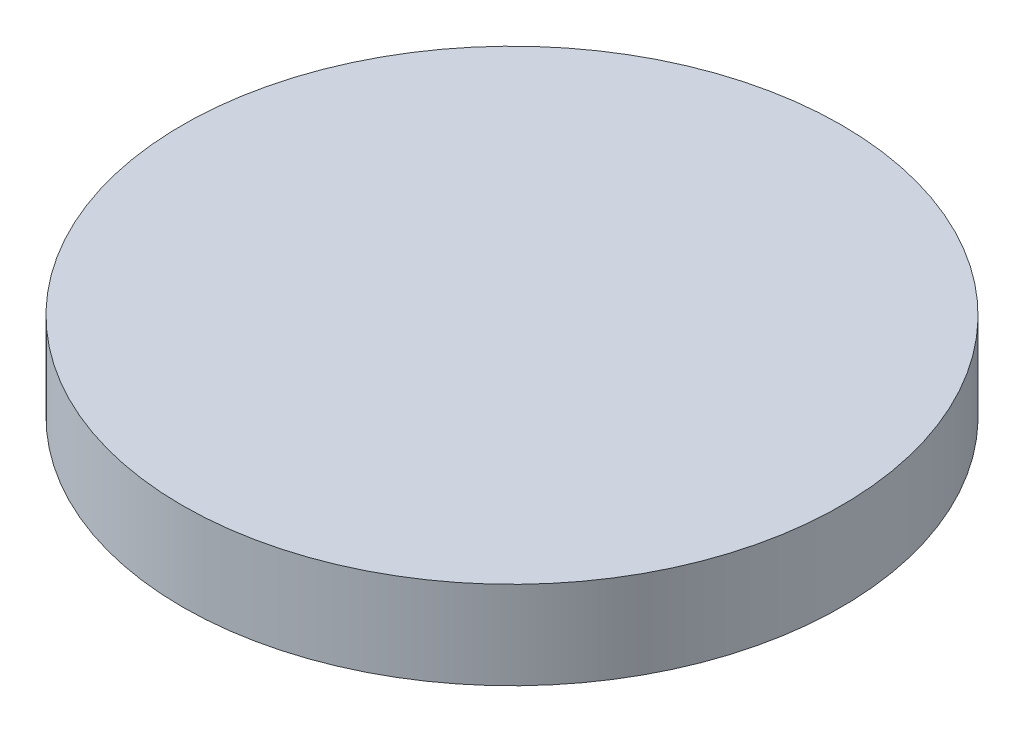
ISO-10303-21;
HEADER;
FILE_DESCRIPTION(('STEP AP214'),'2;1');
FILE_NAME('part.step','',(''),(''),'','','');
FILE_SCHEMA(('AUTOMOTIVE_DESIGN { 1 0 10303 214 1 1 1 1 }'));
ENDSEC;
DATA;
#1=APPLICATION_CONTEXT('core data for automotive mechanical design processes');
#2=APPLICATION_PROTOCOL_DEFINITION('international standard','automotive_design',2000,#1);
#3=PRODUCT_CONTEXT('',#1,'mechanical');
#4=PRODUCT('Part','Part','',(#3));
#5=PRODUCT_RELATED_PRODUCT_CATEGORY('part','',(#4));
#6=PRODUCT_DEFINITION_FORMATION('','',#4);
#7=PRODUCT_DEFINITION_CONTEXT('part definition',#1,'design');
#8=PRODUCT_DEFINITION('design','',#6,#7);
#9=PRODUCT_DEFINITION_SHAPE('','',#8);
#10=(LENGTH_UNIT() NAMED_UNIT(*) SI_UNIT(.MILLI.,.METRE.));
#11=(NAMED_UNIT(*) PLANE_ANGLE_UNIT() SI_UNIT($,.RADIAN.));
#12=(NAMED_UNIT(*) SI_UNIT($,.STERADIAN.) SOLID_ANGLE_UNIT());
#13=UNCERTAINTY_MEASURE_WITH_UNIT(LENGTH_MEASURE(1.E-05),#10,'distance_accuracy_value','');
#14=(GEOMETRIC_REPRESENTATION_CONTEXT(3) GLOBAL_UNCERTAINTY_ASSIGNED_CONTEXT((#13)) GLOBAL_UNIT_ASSIGNED_CONTEXT((#10,
#11,#12)) REPRESENTATION_CONTEXT('',''));
#15=CARTESIAN_POINT('',(0.,0.,0.));
#16=DIRECTION('',(0.,0.,1.));
#17=DIRECTION('',(1.,0.,0.));
#18=AXIS2_PLACEMENT_3D('',#15,#16,#17);
#19=CARTESIAN_POINT('',(0.,5.08,0.));
#20=DIRECTION('',(0.,-1.,0.));
#21=DIRECTION('',(0.,0.,-1.));
#22=AXIS2_PLACEMENT_3D('',#19,#20,#21);
#23=CYLINDRICAL_SURFACE('',#22,19.05);
#24=CARTESIAN_POINT('',(0.,5.08,0.));
#25=DIRECTION('',(0.,1.,0.));
#26=DIRECTION('',(0.,0.,1.));
#27=AXIS2_PLACEMENT_3D('',#24,#25,#26);
#28=CIRCLE('',#27,19.05);
#29=CARTESIAN_POINT('',(0.,5.08,19.05));
#30=VERTEX_POINT('',#29);
#31=EDGE_CURVE('E10',#30,#30,#28,.T.);
#32=ORIENTED_EDGE('',*,*,#31,.F.);
#33=EDGE_LOOP('',(#32));
#34=FACE_BOUND('',#33,.T.);
#35=CARTESIAN_POINT('',(0.,0.,0.));
#36=DIRECTION('',(0.,1.,0.));
#37=DIRECTION('',(0.,0.,1.));
#38=AXIS2_PLACEMENT_3D('',#35,#36,#37);
#39=CIRCLE('',#38,19.05);
#40=CARTESIAN_POINT('',(0.,0.,19.05));
#41=VERTEX_POINT('',#40);
#42=EDGE_CURVE('E34',#41,#41,#39,.T.);
#43=ORIENTED_EDGE('',*,*,#42,.T.);
#44=EDGE_LOOP('',(#43));
#45=FACE_BOUND('',#44,.T.);
#46=ADVANCED_FACE('F31',(#34,#45),#23,.T.);
#47=CARTESIAN_POINT('',(0.,5.08,0.));
#48=DIRECTION('',(0.,1.,0.));
#49=DIRECTION('',(0.,0.,1.));
#50=AXIS2_PLACEMENT_3D('',#47,#48,#49);
#51=PLANE('',#50);
#52=ORIENTED_EDGE('',*,*,#31,.T.);
#53=EDGE_LOOP('',(#52));
#54=FACE_BOUND('',#53,.T.);
#55=ADVANCED_FACE('F46',(#54),#51,.T.);
#56=CARTESIAN_POINT('',(0.,0.,0.));
#57=DIRECTION('',(0.,1.,0.));
#58=DIRECTION('',(0.,0.,1.));
#59=AXIS2_PLACEMENT_3D('',#56,#57,#58);
#60=PLANE('',#59);
#61=ORIENTED_EDGE('',*,*,#42,.F.);
#62=EDGE_LOOP('',(#61));
#63=FACE_BOUND('',#62,.T.);
#64=ADVANCED_FACE('F44',(#63),#60,.F.);
#65=CLOSED_SHELL('',(#46,#55,#64));
#66=MANIFOLD_SOLID_BREP('B2',#65);
#67=ADVANCED_BREP_SHAPE_REPRESENTATION('',(#18,#66),#14);
#68=SHAPE_DEFINITION_REPRESENTATION(#9,#67);
ENDSEC;
END-ISO-10303-21;
